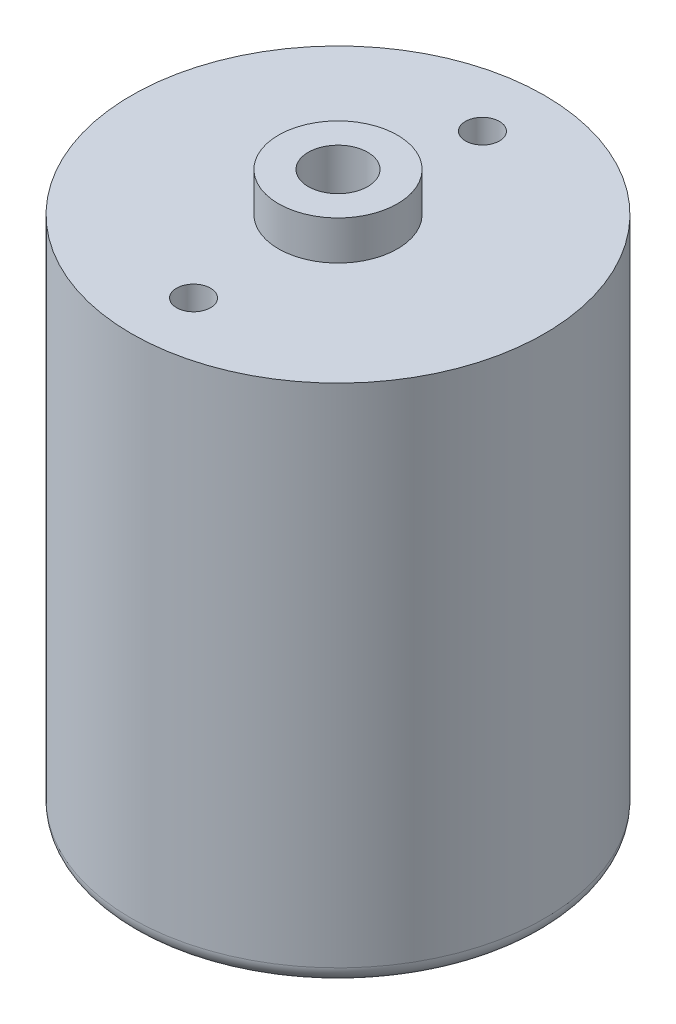
ISO-10303-21;
HEADER;
FILE_DESCRIPTION(('STEP AP214'),'2;1');
FILE_NAME('part.step','',(''),(''),'','','');
FILE_SCHEMA(('AUTOMOTIVE_DESIGN { 1 0 10303 214 1 1 1 1 }'));
ENDSEC;
DATA;
#1=APPLICATION_CONTEXT('core data for automotive mechanical design processes');
#2=APPLICATION_PROTOCOL_DEFINITION('international standard','automotive_design',2000,#1);
#3=PRODUCT_CONTEXT('',#1,'mechanical');
#4=PRODUCT('Part','Part','',(#3));
#5=PRODUCT_RELATED_PRODUCT_CATEGORY('part','',(#4));
#6=PRODUCT_DEFINITION_FORMATION('','',#4);
#7=PRODUCT_DEFINITION_CONTEXT('part definition',#1,'design');
#8=PRODUCT_DEFINITION('design','',#6,#7);
#9=PRODUCT_DEFINITION_SHAPE('','',#8);
#10=(LENGTH_UNIT() NAMED_UNIT(*) SI_UNIT(.MILLI.,.METRE.));
#11=(NAMED_UNIT(*) PLANE_ANGLE_UNIT() SI_UNIT($,.RADIAN.));
#12=(NAMED_UNIT(*) SI_UNIT($,.STERADIAN.) SOLID_ANGLE_UNIT());
#13=UNCERTAINTY_MEASURE_WITH_UNIT(LENGTH_MEASURE(1.E-05),#10,'distance_accuracy_value','');
#14=(GEOMETRIC_REPRESENTATION_CONTEXT(3) GLOBAL_UNCERTAINTY_ASSIGNED_CONTEXT((#13)) GLOBAL_UNIT_ASSIGNED_CONTEXT((#10,
#11,#12)) REPRESENTATION_CONTEXT('',''));
#15=CARTESIAN_POINT('',(0.,0.,0.));
#16=DIRECTION('',(0.,0.,1.));
#17=DIRECTION('',(1.,0.,0.));
#18=AXIS2_PLACEMENT_3D('',#15,#16,#17);
#19=CARTESIAN_POINT('',(0.,30.8,0.));
#20=DIRECTION('',(0.,-1.,0.));
#21=DIRECTION('',(0.,0.,-1.));
#22=AXIS2_PLACEMENT_3D('',#19,#20,#21);
#23=CYLINDRICAL_SURFACE('',#22,12.15);
#24=CARTESIAN_POINT('',(0.,1.,0.));
#25=DIRECTION('',(0.,1.,0.));
#26=DIRECTION('',(0.,0.,1.));
#27=AXIS2_PLACEMENT_3D('',#24,#25,#26);
#28=CIRCLE('',#27,12.15);
#29=CARTESIAN_POINT('',(0.,0.999999999999997,-12.15));
#30=VERTEX_POINT('',#29);
#31=EDGE_CURVE('E46',#30,#30,#28,.T.);
#32=CARTESIAN_POINT('',(0.,30.8,0.));
#33=DIRECTION('',(0.,1.,0.));
#34=DIRECTION('',(0.,0.,1.));
#35=AXIS2_PLACEMENT_3D('',#32,#33,#34);
#36=CIRCLE('',#35,12.15);
#37=CARTESIAN_POINT('',(0.,30.8,-12.15));
#38=VERTEX_POINT('',#37);
#39=EDGE_CURVE('E51',#38,#38,#36,.T.);
#40=CARTESIAN_POINT('',(0.,0.999999999999997,-12.15));
#41=CARTESIAN_POINT('',(0.,1.31041666666667,-12.15));
#42=CARTESIAN_POINT('',(0.,1.62083333333333,-12.15));
#43=CARTESIAN_POINT('',(0.,2.24166666666666,-12.15));
#44=CARTESIAN_POINT('',(0.,2.55208333333333,-12.15));
#45=CARTESIAN_POINT('',(0.,3.17291666666666,-12.15));
#46=CARTESIAN_POINT('',(0.,3.48333333333333,-12.15));
#47=CARTESIAN_POINT('',(0.,4.10416666666667,-12.15));
#48=CARTESIAN_POINT('',(0.,4.41458333333333,-12.15));
#49=CARTESIAN_POINT('',(0.,5.03541666666666,-12.15));
#50=CARTESIAN_POINT('',(0.,5.34583333333333,-12.15));
#51=CARTESIAN_POINT('',(0.,5.96666666666667,-12.15));
#52=CARTESIAN_POINT('',(0.,6.27708333333333,-12.15));
#53=CARTESIAN_POINT('',(0.,6.89791666666667,-12.15));
#54=CARTESIAN_POINT('',(0.,7.20833333333333,-12.15));
#55=CARTESIAN_POINT('',(0.,7.82916666666666,-12.15));
#56=CARTESIAN_POINT('',(0.,8.13958333333333,-12.15));
#57=CARTESIAN_POINT('',(0.,8.76041666666666,-12.15));
#58=CARTESIAN_POINT('',(0.,9.07083333333333,-12.15));
#59=CARTESIAN_POINT('',(0.,9.69166666666666,-12.15));
#60=CARTESIAN_POINT('',(0.,10.0020833333333,-12.15));
#61=CARTESIAN_POINT('',(0.,10.6229166666667,-12.15));
#62=CARTESIAN_POINT('',(0.,10.9333333333333,-12.15));
#63=CARTESIAN_POINT('',(0.,11.5541666666667,-12.15));
#64=CARTESIAN_POINT('',(0.,11.8645833333333,-12.15));
#65=CARTESIAN_POINT('',(0.,12.4854166666667,-12.15));
#66=CARTESIAN_POINT('',(0.,12.7958333333333,-12.15));
#67=CARTESIAN_POINT('',(0.,13.4166666666667,-12.15));
#68=CARTESIAN_POINT('',(0.,13.7270833333333,-12.15));
#69=CARTESIAN_POINT('',(0.,14.3479166666667,-12.15));
#70=CARTESIAN_POINT('',(0.,14.6583333333333,-12.15));
#71=CARTESIAN_POINT('',(0.,15.2791666666667,-12.15));
#72=CARTESIAN_POINT('',(0.,15.5895833333333,-12.15));
#73=CARTESIAN_POINT('',(0.,16.2104166666667,-12.15));
#74=CARTESIAN_POINT('',(0.,16.5208333333333,-12.15));
#75=CARTESIAN_POINT('',(0.,17.1416666666667,-12.15));
#76=CARTESIAN_POINT('',(0.,17.4520833333333,-12.15));
#77=CARTESIAN_POINT('',(0.,18.0729166666667,-12.15));
#78=CARTESIAN_POINT('',(0.,18.3833333333333,-12.15));
#79=CARTESIAN_POINT('',(0.,19.0041666666667,-12.15));
#80=CARTESIAN_POINT('',(0.,19.3145833333333,-12.15));
#81=CARTESIAN_POINT('',(0.,19.9354166666667,-12.15));
#82=CARTESIAN_POINT('',(0.,20.2458333333333,-12.15));
#83=CARTESIAN_POINT('',(0.,20.8666666666667,-12.15));
#84=CARTESIAN_POINT('',(0.,21.1770833333333,-12.15));
#85=CARTESIAN_POINT('',(0.,21.7979166666667,-12.15));
#86=CARTESIAN_POINT('',(0.,22.1083333333333,-12.15));
#87=CARTESIAN_POINT('',(0.,22.7291666666667,-12.15));
#88=CARTESIAN_POINT('',(0.,23.0395833333333,-12.15));
#89=CARTESIAN_POINT('',(0.,23.6604166666667,-12.15));
#90=CARTESIAN_POINT('',(0.,23.9708333333333,-12.15));
#91=CARTESIAN_POINT('',(0.,24.5916666666667,-12.15));
#92=CARTESIAN_POINT('',(0.,24.9020833333333,-12.15));
#93=CARTESIAN_POINT('',(0.,25.5229166666667,-12.15));
#94=CARTESIAN_POINT('',(0.,25.8333333333333,-12.15));
#95=CARTESIAN_POINT('',(0.,26.4541666666667,-12.15));
#96=CARTESIAN_POINT('',(0.,26.7645833333333,-12.15));
#97=CARTESIAN_POINT('',(0.,27.3854166666667,-12.15));
#98=CARTESIAN_POINT('',(0.,27.6958333333333,-12.15));
#99=CARTESIAN_POINT('',(0.,28.3166666666667,-12.15));
#100=CARTESIAN_POINT('',(0.,28.6270833333333,-12.15));
#101=CARTESIAN_POINT('',(0.,29.2479166666667,-12.15));
#102=CARTESIAN_POINT('',(0.,29.5583333333333,-12.15));
#103=CARTESIAN_POINT('',(0.,30.1791666666667,-12.15));
#104=CARTESIAN_POINT('',(0.,30.4895833333333,-12.15));
#105=CARTESIAN_POINT('',(0.,30.8,-12.15));
#106=B_SPLINE_CURVE_WITH_KNOTS('',3,(#40,#41,#42,#43,#44,#45,#46,#47,#48,#49,#50,#51,#52,#53,
#54,#55,#56,#57,#58,#59,#60,#61,#62,#63,#64,#65,#66,#67,#68,#69,#70,#71,#72,#73,#74,#75,#76,#77,
#78,#79,#80,#81,#82,#83,#84,#85,#86,#87,#88,#89,#90,#91,#92,#93,#94,#95,#96,#97,#98,#99,#100,
#101,#102,#103,#104,#105),.UNSPECIFIED.,.F.,.F.,(4,2,2,2,2,2,2,2,2,2,2,2,2,2,2,2,2,2,2,2,2,2,2,
2,2,2,2,2,2,2,2,2,4),(0.,0.931250000000001,1.8625,2.79375,3.725,4.65625,5.5875,6.51875,7.45,
8.38125,9.3125,10.24375,11.175,12.10625,13.0375,13.96875,14.9,15.83125,16.7625,17.69375,18.625,
19.55625,20.4875,21.41875,22.35,23.28125,24.2125,25.14375,26.075,27.00625,27.9375,28.86875,
29.8),.UNSPECIFIED.);
#107=EDGE_CURVE('BSEAM34',#30,#38,#106,.T.);
#108=ORIENTED_EDGE('',*,*,#31,.T.);
#109=ORIENTED_EDGE('',*,*,#39,.F.);
#110=ORIENTED_EDGE('',*,*,#107,.T.);
#111=ORIENTED_EDGE('',*,*,#107,.F.);
#112=EDGE_LOOP('',(#108,#110,#109,#111));
#113=FACE_BOUND('',#112,.T.);
#114=ADVANCED_FACE('F34',(#113),#23,.T.);
#115=CARTESIAN_POINT('',(0.,30.8,0.));
#116=DIRECTION('',(0.,1.,0.));
#117=DIRECTION('',(0.,0.,1.));
#118=AXIS2_PLACEMENT_3D('',#115,#116,#117);
#119=PLANE('',#118);
#120=CARTESIAN_POINT('',(0.,30.8,8.5));
#121=DIRECTION('',(0.,1.,0.));
#122=DIRECTION('',(0.,0.,1.));
#123=AXIS2_PLACEMENT_3D('',#120,#121,#122);
#124=CIRCLE('',#123,1.);
#125=CARTESIAN_POINT('',(0.,30.8,9.5));
#126=VERTEX_POINT('',#125);
#127=EDGE_CURVE('E103',#126,#126,#124,.T.);
#128=ORIENTED_EDGE('',*,*,#127,.F.);
#129=EDGE_LOOP('',(#128));
#130=FACE_BOUND('',#129,.T.);
#131=CARTESIAN_POINT('',(0.,30.8,-8.5));
#132=DIRECTION('',(0.,1.,0.));
#133=DIRECTION('',(0.,0.,1.));
#134=AXIS2_PLACEMENT_3D('',#131,#132,#133);
#135=CIRCLE('',#134,1.);
#136=CARTESIAN_POINT('',(0.,30.8,-7.5));
#137=VERTEX_POINT('',#136);
#138=EDGE_CURVE('E109',#137,#137,#135,.T.);
#139=ORIENTED_EDGE('',*,*,#138,.F.);
#140=EDGE_LOOP('',(#139));
#141=FACE_BOUND('',#140,.T.);
#142=CARTESIAN_POINT('',(0.,30.8,0.));
#143=DIRECTION('',(0.,1.,0.));
#144=DIRECTION('',(0.,0.,1.));
#145=AXIS2_PLACEMENT_3D('',#142,#143,#144);
#146=CIRCLE('',#145,3.5);
#147=CARTESIAN_POINT('',(0.,30.8,3.5));
#148=VERTEX_POINT('',#147);
#149=EDGE_CURVE('E10',#148,#148,#146,.T.);
#150=ORIENTED_EDGE('',*,*,#149,.F.);
#151=EDGE_LOOP('',(#150));
#152=FACE_BOUND('',#151,.T.);
#153=ORIENTED_EDGE('',*,*,#39,.T.);
#154=EDGE_LOOP('',(#153));
#155=FACE_BOUND('',#154,.T.);
#156=ADVANCED_FACE('F68',(#130,#141,#152,#155),#119,.T.);
#157=CARTESIAN_POINT('',(0.,0.,0.));
#158=DIRECTION('',(0.,1.,0.));
#159=DIRECTION('',(0.,0.,1.));
#160=AXIS2_PLACEMENT_3D('',#157,#158,#159);
#161=PLANE('',#160);
#162=CARTESIAN_POINT('',(0.,0.,0.));
#163=DIRECTION('',(0.,1.,0.));
#164=DIRECTION('',(0.,0.,1.));
#165=AXIS2_PLACEMENT_3D('',#162,#163,#164);
#166=CIRCLE('',#165,1.75);
#167=CARTESIAN_POINT('',(0.,0.,1.75));
#168=VERTEX_POINT('',#167);
#169=EDGE_CURVE('E98',#168,#168,#166,.T.);
#170=ORIENTED_EDGE('',*,*,#169,.T.);
#171=EDGE_LOOP('',(#170));
#172=FACE_BOUND('',#171,.T.);
#173=CARTESIAN_POINT('',(0.,0.,8.5));
#174=DIRECTION('',(0.,1.,0.));
#175=DIRECTION('',(0.,0.,1.));
#176=AXIS2_PLACEMENT_3D('',#173,#174,#175);
#177=CIRCLE('',#176,1.);
#178=CARTESIAN_POINT('',(0.,0.,9.5));
#179=VERTEX_POINT('',#178);
#180=EDGE_CURVE('E106',#179,#179,#177,.T.);
#181=ORIENTED_EDGE('',*,*,#180,.T.);
#182=EDGE_LOOP('',(#181));
#183=FACE_BOUND('',#182,.T.);
#184=CARTESIAN_POINT('',(0.,0.,-8.5));
#185=DIRECTION('',(0.,1.,0.));
#186=DIRECTION('',(0.,0.,1.));
#187=AXIS2_PLACEMENT_3D('',#184,#185,#186);
#188=CIRCLE('',#187,1.);
#189=CARTESIAN_POINT('',(0.,0.,-7.5));
#190=VERTEX_POINT('',#189);
#191=EDGE_CURVE('E112',#190,#190,#188,.T.);
#192=ORIENTED_EDGE('',*,*,#191,.T.);
#193=EDGE_LOOP('',(#192));
#194=FACE_BOUND('',#193,.T.);
#195=CARTESIAN_POINT('',(0.,0.,0.));
#196=DIRECTION('',(0.,1.,0.));
#197=DIRECTION('',(0.,0.,1.));
#198=AXIS2_PLACEMENT_3D('',#195,#196,#197);
#199=CIRCLE('',#198,11.15);
#200=CARTESIAN_POINT('',(0.,0.,11.15));
#201=VERTEX_POINT('',#200);
#202=EDGE_CURVE('E38',#201,#201,#199,.F.);
#203=ORIENTED_EDGE('',*,*,#202,.T.);
#204=EDGE_LOOP('',(#203));
#205=FACE_BOUND('',#204,.T.);
#206=ADVANCED_FACE('F60',(#172,#183,#194,#205),#161,.F.);
#207=CARTESIAN_POINT('',(0.,1.,0.));
#208=DIRECTION('',(0.,1.,0.));
#209=DIRECTION('',(0.,0.,1.));
#210=AXIS2_PLACEMENT_3D('',#207,#208,#209);
#211=TOROIDAL_SURFACE('',#210,11.15,1.);
#212=ORIENTED_EDGE('',*,*,#202,.F.);
#213=EDGE_LOOP('',(#212));
#214=FACE_BOUND('',#213,.T.);
#215=ORIENTED_EDGE('',*,*,#31,.F.);
#216=EDGE_LOOP('',(#215));
#217=FACE_BOUND('',#216,.T.);
#218=ADVANCED_FACE('F36',(#214,#217),#211,.T.);
#219=CARTESIAN_POINT('',(0.,0.,0.));
#220=DIRECTION('',(0.,1.,0.));
#221=DIRECTION('',(0.,0.,1.));
#222=AXIS2_PLACEMENT_3D('',#219,#220,#221);
#223=CYLINDRICAL_SURFACE('',#222,3.5);
#224=CARTESIAN_POINT('',(0.,33.1,0.));
#225=DIRECTION('',(0.,1.,0.));
#226=DIRECTION('',(0.,0.,1.));
#227=AXIS2_PLACEMENT_3D('',#224,#225,#226);
#228=CIRCLE('',#227,3.5);
#229=CARTESIAN_POINT('',(0.,33.1,3.5));
#230=VERTEX_POINT('',#229);
#231=EDGE_CURVE('E49',#230,#230,#228,.T.);
#232=CARTESIAN_POINT('',(0.,30.8,3.5));
#233=CARTESIAN_POINT('',(0.,30.8239583333333,3.5));
#234=CARTESIAN_POINT('',(0.,30.8479166666667,3.5));
#235=CARTESIAN_POINT('',(0.,30.8958333333333,3.5));
#236=CARTESIAN_POINT('',(0.,30.9197916666667,3.5));
#237=CARTESIAN_POINT('',(0.,30.9677083333333,3.5));
#238=CARTESIAN_POINT('',(0.,30.9916666666667,3.5));
#239=CARTESIAN_POINT('',(0.,31.0395833333333,3.5));
#240=CARTESIAN_POINT('',(0.,31.0635416666667,3.5));
#241=CARTESIAN_POINT('',(0.,31.1114583333333,3.5));
#242=CARTESIAN_POINT('',(0.,31.1354166666667,3.5));
#243=CARTESIAN_POINT('',(0.,31.1833333333333,3.5));
#244=CARTESIAN_POINT('',(0.,31.2072916666667,3.5));
#245=CARTESIAN_POINT('',(0.,31.2552083333333,3.5));
#246=CARTESIAN_POINT('',(0.,31.2791666666667,3.5));
#247=CARTESIAN_POINT('',(0.,31.3270833333333,3.5));
#248=CARTESIAN_POINT('',(0.,31.3510416666667,3.5));
#249=CARTESIAN_POINT('',(0.,31.3989583333333,3.5));
#250=CARTESIAN_POINT('',(0.,31.4229166666667,3.5));
#251=CARTESIAN_POINT('',(0.,31.4708333333333,3.5));
#252=CARTESIAN_POINT('',(0.,31.4947916666667,3.5));
#253=CARTESIAN_POINT('',(0.,31.5427083333333,3.5));
#254=CARTESIAN_POINT('',(0.,31.5666666666667,3.5));
#255=CARTESIAN_POINT('',(0.,31.6145833333333,3.5));
#256=CARTESIAN_POINT('',(0.,31.6385416666667,3.5));
#257=CARTESIAN_POINT('',(0.,31.6864583333333,3.5));
#258=CARTESIAN_POINT('',(0.,31.7104166666667,3.5));
#259=CARTESIAN_POINT('',(0.,31.7583333333333,3.5));
#260=CARTESIAN_POINT('',(0.,31.7822916666667,3.5));
#261=CARTESIAN_POINT('',(0.,31.8302083333333,3.5));
#262=CARTESIAN_POINT('',(0.,31.8541666666667,3.5));
#263=CARTESIAN_POINT('',(0.,31.9020833333333,3.5));
#264=CARTESIAN_POINT('',(0.,31.9260416666667,3.5));
#265=CARTESIAN_POINT('',(0.,31.9739583333333,3.5));
#266=CARTESIAN_POINT('',(0.,31.9979166666667,3.5));
#267=CARTESIAN_POINT('',(0.,32.0458333333333,3.5));
#268=CARTESIAN_POINT('',(0.,32.0697916666667,3.5));
#269=CARTESIAN_POINT('',(0.,32.1177083333333,3.5));
#270=CARTESIAN_POINT('',(0.,32.1416666666667,3.5));
#271=CARTESIAN_POINT('',(0.,32.1895833333333,3.5));
#272=CARTESIAN_POINT('',(0.,32.2135416666667,3.5));
#273=CARTESIAN_POINT('',(0.,32.2614583333333,3.5));
#274=CARTESIAN_POINT('',(0.,32.2854166666667,3.5));
#275=CARTESIAN_POINT('',(0.,32.3333333333333,3.5));
#276=CARTESIAN_POINT('',(0.,32.3572916666667,3.5));
#277=CARTESIAN_POINT('',(0.,32.4052083333333,3.5));
#278=CARTESIAN_POINT('',(0.,32.4291666666667,3.5));
#279=CARTESIAN_POINT('',(0.,32.4770833333333,3.5));
#280=CARTESIAN_POINT('',(0.,32.5010416666667,3.5));
#281=CARTESIAN_POINT('',(0.,32.5489583333333,3.5));
#282=CARTESIAN_POINT('',(0.,32.5729166666667,3.5));
#283=CARTESIAN_POINT('',(0.,32.6208333333333,3.5));
#284=CARTESIAN_POINT('',(0.,32.6447916666667,3.5));
#285=CARTESIAN_POINT('',(0.,32.6927083333333,3.5));
#286=CARTESIAN_POINT('',(0.,32.7166666666667,3.5));
#287=CARTESIAN_POINT('',(0.,32.7645833333333,3.5));
#288=CARTESIAN_POINT('',(0.,32.7885416666667,3.5));
#289=CARTESIAN_POINT('',(0.,32.8364583333333,3.5));
#290=CARTESIAN_POINT('',(0.,32.8604166666667,3.5));
#291=CARTESIAN_POINT('',(0.,32.9083333333333,3.5));
#292=CARTESIAN_POINT('',(0.,32.9322916666667,3.5));
#293=CARTESIAN_POINT('',(0.,32.9802083333333,3.5));
#294=CARTESIAN_POINT('',(0.,33.0041666666667,3.5));
#295=CARTESIAN_POINT('',(0.,33.0520833333333,3.5));
#296=CARTESIAN_POINT('',(0.,33.0760416666667,3.5));
#297=CARTESIAN_POINT('',(0.,33.1,3.5));
#298=B_SPLINE_CURVE_WITH_KNOTS('',3,(#232,#233,#234,#235,#236,#237,#238,#239,#240,#241,#242,
#243,#244,#245,#246,#247,#248,#249,#250,#251,#252,#253,#254,#255,#256,#257,#258,#259,#260,#261,
#262,#263,#264,#265,#266,#267,#268,#269,#270,#271,#272,#273,#274,#275,#276,#277,#278,#279,#280,
#281,#282,#283,#284,#285,#286,#287,#288,#289,#290,#291,#292,#293,#294,#295,#296,#297),
.UNSPECIFIED.,.F.,.F.,(4,2,2,2,2,2,2,2,2,2,2,2,2,2,2,2,2,2,2,2,2,2,2,2,2,2,2,2,2,2,2,2,4),(0.,
0.071874999999999,0.143750000000002,0.215625000000001,0.2875,0.359375000000002,
0.431250000000001,0.503124999999997,0.574999999999996,0.646874999999995,0.718750000000001,
0.790625,0.862499999999999,0.934374999999998,1.00625,1.078125,1.15,1.221875,1.29375,1.365625,
1.4375,1.509375,1.58125,1.653125,1.725,1.796875,1.86875,1.940625,2.0125,2.084375,2.15625,
2.228125,2.3),.UNSPECIFIED.);
#299=EDGE_CURVE('BSEAM59',#148,#230,#298,.T.);
#300=ORIENTED_EDGE('',*,*,#149,.T.);
#301=ORIENTED_EDGE('',*,*,#231,.F.);
#302=ORIENTED_EDGE('',*,*,#299,.T.);
#303=ORIENTED_EDGE('',*,*,#299,.F.);
#304=EDGE_LOOP('',(#300,#302,#301,#303));
#305=FACE_BOUND('',#304,.T.);
#306=ADVANCED_FACE('F59',(#305),#223,.T.);
#307=CARTESIAN_POINT('',(0.,33.1,0.));
#308=DIRECTION('',(0.,1.,0.));
#309=DIRECTION('',(0.,0.,1.));
#310=AXIS2_PLACEMENT_3D('',#307,#308,#309);
#311=PLANE('',#310);
#312=CARTESIAN_POINT('',(0.,33.1,0.));
#313=DIRECTION('',(0.,1.,0.));
#314=DIRECTION('',(0.,0.,1.));
#315=AXIS2_PLACEMENT_3D('',#312,#313,#314);
#316=CIRCLE('',#315,1.75);
#317=CARTESIAN_POINT('',(0.,33.1,1.75));
#318=VERTEX_POINT('',#317);
#319=EDGE_CURVE('E101',#318,#318,#316,.T.);
#320=ORIENTED_EDGE('',*,*,#319,.F.);
#321=EDGE_LOOP('',(#320));
#322=FACE_BOUND('',#321,.T.);
#323=ORIENTED_EDGE('',*,*,#231,.T.);
#324=EDGE_LOOP('',(#323));
#325=FACE_BOUND('',#324,.T.);
#326=ADVANCED_FACE('F66',(#322,#325),#311,.T.);
#327=CARTESIAN_POINT('',(0.,0.,-8.5));
#328=DIRECTION('',(0.,1.,0.));
#329=DIRECTION('',(0.,0.,1.));
#330=AXIS2_PLACEMENT_3D('',#327,#328,#329);
#331=CYLINDRICAL_SURFACE('',#330,1.);
#332=CARTESIAN_POINT('',(0.,0.,-7.5));
#333=CARTESIAN_POINT('',(0.,0.320833333333333,-7.5));
#334=CARTESIAN_POINT('',(0.,0.641666666666667,-7.5));
#335=CARTESIAN_POINT('',(0.,1.28333333333333,-7.5));
#336=CARTESIAN_POINT('',(0.,1.60416666666667,-7.5));
#337=CARTESIAN_POINT('',(0.,2.24583333333333,-7.5));
#338=CARTESIAN_POINT('',(0.,2.56666666666667,-7.5));
#339=CARTESIAN_POINT('',(0.,3.20833333333333,-7.5));
#340=CARTESIAN_POINT('',(0.,3.52916666666667,-7.5));
#341=CARTESIAN_POINT('',(0.,4.17083333333333,-7.5));
#342=CARTESIAN_POINT('',(0.,4.49166666666667,-7.5));
#343=CARTESIAN_POINT('',(0.,5.13333333333333,-7.5));
#344=CARTESIAN_POINT('',(0.,5.45416666666667,-7.5));
#345=CARTESIAN_POINT('',(0.,6.09583333333333,-7.5));
#346=CARTESIAN_POINT('',(0.,6.41666666666667,-7.5));
#347=CARTESIAN_POINT('',(0.,7.05833333333333,-7.5));
#348=CARTESIAN_POINT('',(0.,7.37916666666667,-7.5));
#349=CARTESIAN_POINT('',(0.,8.02083333333333,-7.5));
#350=CARTESIAN_POINT('',(0.,8.34166666666667,-7.5));
#351=CARTESIAN_POINT('',(0.,8.98333333333333,-7.5));
#352=CARTESIAN_POINT('',(0.,9.30416666666667,-7.5));
#353=CARTESIAN_POINT('',(0.,9.94583333333333,-7.5));
#354=CARTESIAN_POINT('',(0.,10.2666666666667,-7.5));
#355=CARTESIAN_POINT('',(0.,10.9083333333333,-7.5));
#356=CARTESIAN_POINT('',(0.,11.2291666666667,-7.5));
#357=CARTESIAN_POINT('',(0.,11.8708333333333,-7.5));
#358=CARTESIAN_POINT('',(0.,12.1916666666667,-7.5));
#359=CARTESIAN_POINT('',(0.,12.8333333333333,-7.5));
#360=CARTESIAN_POINT('',(0.,13.1541666666667,-7.5));
#361=CARTESIAN_POINT('',(0.,13.7958333333333,-7.5));
#362=CARTESIAN_POINT('',(0.,14.1166666666667,-7.5));
#363=CARTESIAN_POINT('',(0.,14.7583333333333,-7.5));
#364=CARTESIAN_POINT('',(0.,15.0791666666667,-7.5));
#365=CARTESIAN_POINT('',(0.,15.7208333333333,-7.5));
#366=CARTESIAN_POINT('',(0.,16.0416666666667,-7.5));
#367=CARTESIAN_POINT('',(0.,16.6833333333333,-7.5));
#368=CARTESIAN_POINT('',(0.,17.0041666666667,-7.5));
#369=CARTESIAN_POINT('',(0.,17.6458333333333,-7.5));
#370=CARTESIAN_POINT('',(0.,17.9666666666667,-7.5));
#371=CARTESIAN_POINT('',(0.,18.6083333333333,-7.5));
#372=CARTESIAN_POINT('',(0.,18.9291666666667,-7.5));
#373=CARTESIAN_POINT('',(0.,19.5708333333333,-7.5));
#374=CARTESIAN_POINT('',(0.,19.8916666666667,-7.5));
#375=CARTESIAN_POINT('',(0.,20.5333333333333,-7.5));
#376=CARTESIAN_POINT('',(0.,20.8541666666667,-7.5));
#377=CARTESIAN_POINT('',(0.,21.4958333333333,-7.5));
#378=CARTESIAN_POINT('',(0.,21.8166666666667,-7.5));
#379=CARTESIAN_POINT('',(0.,22.4583333333333,-7.5));
#380=CARTESIAN_POINT('',(0.,22.7791666666667,-7.5));
#381=CARTESIAN_POINT('',(0.,23.4208333333333,-7.5));
#382=CARTESIAN_POINT('',(0.,23.7416666666667,-7.5));
#383=CARTESIAN_POINT('',(0.,24.3833333333333,-7.5));
#384=CARTESIAN_POINT('',(0.,24.7041666666667,-7.5));
#385=CARTESIAN_POINT('',(0.,25.3458333333333,-7.5));
#386=CARTESIAN_POINT('',(0.,25.6666666666667,-7.5));
#387=CARTESIAN_POINT('',(0.,26.3083333333333,-7.5));
#388=CARTESIAN_POINT('',(0.,26.6291666666667,-7.5));
#389=CARTESIAN_POINT('',(0.,27.2708333333333,-7.5));
#390=CARTESIAN_POINT('',(0.,27.5916666666667,-7.5));
#391=CARTESIAN_POINT('',(0.,28.2333333333333,-7.5));
#392=CARTESIAN_POINT('',(0.,28.5541666666667,-7.5));
#393=CARTESIAN_POINT('',(0.,29.1958333333333,-7.5));
#394=CARTESIAN_POINT('',(0.,29.5166666666667,-7.5));
#395=CARTESIAN_POINT('',(0.,30.1583333333333,-7.5));
#396=CARTESIAN_POINT('',(0.,30.4791666666667,-7.5));
#397=CARTESIAN_POINT('',(0.,30.8,-7.5));
#398=B_SPLINE_CURVE_WITH_KNOTS('',3,(#332,#333,#334,#335,#336,#337,#338,#339,#340,#341,#342,
#343,#344,#345,#346,#347,#348,#349,#350,#351,#352,#353,#354,#355,#356,#357,#358,#359,#360,#361,
#362,#363,#364,#365,#366,#367,#368,#369,#370,#371,#372,#373,#374,#375,#376,#377,#378,#379,#380,
#381,#382,#383,#384,#385,#386,#387,#388,#389,#390,#391,#392,#393,#394,#395,#396,#397),
.UNSPECIFIED.,.F.,.F.,(4,2,2,2,2,2,2,2,2,2,2,2,2,2,2,2,2,2,2,2,2,2,2,2,2,2,2,2,2,2,2,2,4),(0.,
0.9625,1.925,2.8875,3.85,4.8125,5.775,6.7375,7.7,8.6625,9.625,10.5875,11.55,12.5125,13.475,
14.4375,15.4,16.3625,17.325,18.2875,19.25,20.2125,21.175,22.1375,23.1,24.0625,25.025,25.9875,
26.95,27.9125,28.875,29.8375,30.8),.UNSPECIFIED.);
#399=EDGE_CURVE('BSEAM81',#190,#137,#398,.T.);
#400=ORIENTED_EDGE('',*,*,#191,.F.);
#401=ORIENTED_EDGE('',*,*,#138,.T.);
#402=ORIENTED_EDGE('',*,*,#399,.T.);
#403=ORIENTED_EDGE('',*,*,#399,.F.);
#404=EDGE_LOOP('',(#400,#402,#401,#403));
#405=FACE_BOUND('',#404,.T.);
#406=ADVANCED_FACE('F81',(#405),#331,.F.);
#407=CARTESIAN_POINT('',(0.,0.,8.5));
#408=DIRECTION('',(0.,1.,0.));
#409=DIRECTION('',(0.,0.,1.));
#410=AXIS2_PLACEMENT_3D('',#407,#408,#409);
#411=CYLINDRICAL_SURFACE('',#410,1.);
#412=CARTESIAN_POINT('',(0.,0.,9.5));
#413=CARTESIAN_POINT('',(0.,0.320833333333333,9.5));
#414=CARTESIAN_POINT('',(0.,0.641666666666667,9.5));
#415=CARTESIAN_POINT('',(0.,1.28333333333333,9.5));
#416=CARTESIAN_POINT('',(0.,1.60416666666667,9.5));
#417=CARTESIAN_POINT('',(0.,2.24583333333333,9.5));
#418=CARTESIAN_POINT('',(0.,2.56666666666667,9.5));
#419=CARTESIAN_POINT('',(0.,3.20833333333333,9.5));
#420=CARTESIAN_POINT('',(0.,3.52916666666667,9.5));
#421=CARTESIAN_POINT('',(0.,4.17083333333333,9.5));
#422=CARTESIAN_POINT('',(0.,4.49166666666667,9.5));
#423=CARTESIAN_POINT('',(0.,5.13333333333333,9.5));
#424=CARTESIAN_POINT('',(0.,5.45416666666667,9.5));
#425=CARTESIAN_POINT('',(0.,6.09583333333333,9.5));
#426=CARTESIAN_POINT('',(0.,6.41666666666667,9.5));
#427=CARTESIAN_POINT('',(0.,7.05833333333333,9.5));
#428=CARTESIAN_POINT('',(0.,7.37916666666667,9.5));
#429=CARTESIAN_POINT('',(0.,8.02083333333333,9.5));
#430=CARTESIAN_POINT('',(0.,8.34166666666667,9.5));
#431=CARTESIAN_POINT('',(0.,8.98333333333333,9.5));
#432=CARTESIAN_POINT('',(0.,9.30416666666667,9.5));
#433=CARTESIAN_POINT('',(0.,9.94583333333333,9.5));
#434=CARTESIAN_POINT('',(0.,10.2666666666667,9.5));
#435=CARTESIAN_POINT('',(0.,10.9083333333333,9.5));
#436=CARTESIAN_POINT('',(0.,11.2291666666667,9.5));
#437=CARTESIAN_POINT('',(0.,11.8708333333333,9.5));
#438=CARTESIAN_POINT('',(0.,12.1916666666667,9.5));
#439=CARTESIAN_POINT('',(0.,12.8333333333333,9.5));
#440=CARTESIAN_POINT('',(0.,13.1541666666667,9.5));
#441=CARTESIAN_POINT('',(0.,13.7958333333333,9.5));
#442=CARTESIAN_POINT('',(0.,14.1166666666667,9.5));
#443=CARTESIAN_POINT('',(0.,14.7583333333333,9.5));
#444=CARTESIAN_POINT('',(0.,15.0791666666667,9.5));
#445=CARTESIAN_POINT('',(0.,15.7208333333333,9.5));
#446=CARTESIAN_POINT('',(0.,16.0416666666667,9.5));
#447=CARTESIAN_POINT('',(0.,16.6833333333333,9.5));
#448=CARTESIAN_POINT('',(0.,17.0041666666667,9.5));
#449=CARTESIAN_POINT('',(0.,17.6458333333333,9.5));
#450=CARTESIAN_POINT('',(0.,17.9666666666667,9.5));
#451=CARTESIAN_POINT('',(0.,18.6083333333333,9.5));
#452=CARTESIAN_POINT('',(0.,18.9291666666667,9.5));
#453=CARTESIAN_POINT('',(0.,19.5708333333333,9.5));
#454=CARTESIAN_POINT('',(0.,19.8916666666667,9.5));
#455=CARTESIAN_POINT('',(0.,20.5333333333333,9.5));
#456=CARTESIAN_POINT('',(0.,20.8541666666667,9.5));
#457=CARTESIAN_POINT('',(0.,21.4958333333333,9.5));
#458=CARTESIAN_POINT('',(0.,21.8166666666667,9.5));
#459=CARTESIAN_POINT('',(0.,22.4583333333333,9.5));
#460=CARTESIAN_POINT('',(0.,22.7791666666667,9.5));
#461=CARTESIAN_POINT('',(0.,23.4208333333333,9.5));
#462=CARTESIAN_POINT('',(0.,23.7416666666667,9.5));
#463=CARTESIAN_POINT('',(0.,24.3833333333333,9.5));
#464=CARTESIAN_POINT('',(0.,24.7041666666667,9.5));
#465=CARTESIAN_POINT('',(0.,25.3458333333333,9.5));
#466=CARTESIAN_POINT('',(0.,25.6666666666667,9.5));
#467=CARTESIAN_POINT('',(0.,26.3083333333333,9.5));
#468=CARTESIAN_POINT('',(0.,26.6291666666667,9.5));
#469=CARTESIAN_POINT('',(0.,27.2708333333333,9.5));
#470=CARTESIAN_POINT('',(0.,27.5916666666667,9.5));
#471=CARTESIAN_POINT('',(0.,28.2333333333333,9.5));
#472=CARTESIAN_POINT('',(0.,28.5541666666667,9.5));
#473=CARTESIAN_POINT('',(0.,29.1958333333333,9.5));
#474=CARTESIAN_POINT('',(0.,29.5166666666667,9.5));
#475=CARTESIAN_POINT('',(0.,30.1583333333333,9.5));
#476=CARTESIAN_POINT('',(0.,30.4791666666667,9.5));
#477=CARTESIAN_POINT('',(0.,30.8,9.5));
#478=B_SPLINE_CURVE_WITH_KNOTS('',3,(#412,#413,#414,#415,#416,#417,#418,#419,#420,#421,#422,
#423,#424,#425,#426,#427,#428,#429,#430,#431,#432,#433,#434,#435,#436,#437,#438,#439,#440,#441,
#442,#443,#444,#445,#446,#447,#448,#449,#450,#451,#452,#453,#454,#455,#456,#457,#458,#459,#460,
#461,#462,#463,#464,#465,#466,#467,#468,#469,#470,#471,#472,#473,#474,#475,#476,#477),
.UNSPECIFIED.,.F.,.F.,(4,2,2,2,2,2,2,2,2,2,2,2,2,2,2,2,2,2,2,2,2,2,2,2,2,2,2,2,2,2,2,2,4),(0.,
0.9625,1.925,2.8875,3.85,4.8125,5.775,6.7375,7.7,8.6625,9.625,10.5875,11.55,12.5125,13.475,
14.4375,15.4,16.3625,17.325,18.2875,19.25,20.2125,21.175,22.1375,23.1,24.0625,25.025,25.9875,
26.95,27.9125,28.875,29.8375,30.8),.UNSPECIFIED.);
#479=EDGE_CURVE('BSEAM85',#179,#126,#478,.T.);
#480=ORIENTED_EDGE('',*,*,#180,.F.);
#481=ORIENTED_EDGE('',*,*,#127,.T.);
#482=ORIENTED_EDGE('',*,*,#479,.T.);
#483=ORIENTED_EDGE('',*,*,#479,.F.);
#484=EDGE_LOOP('',(#480,#482,#481,#483));
#485=FACE_BOUND('',#484,.T.);
#486=ADVANCED_FACE('F85',(#485),#411,.F.);
#487=CARTESIAN_POINT('',(0.,0.,0.));
#488=DIRECTION('',(0.,1.,0.));
#489=DIRECTION('',(0.,0.,1.));
#490=AXIS2_PLACEMENT_3D('',#487,#488,#489);
#491=CYLINDRICAL_SURFACE('',#490,1.75);
#492=ORIENTED_EDGE('',*,*,#169,.F.);
#493=EDGE_LOOP('',(#492));
#494=FACE_BOUND('',#493,.T.);
#495=ORIENTED_EDGE('',*,*,#319,.T.);
#496=EDGE_LOOP('',(#495));
#497=FACE_BOUND('',#496,.T.);
#498=ADVANCED_FACE('F89',(#494,#497),#491,.F.);
#499=CLOSED_SHELL('',(#114,#156,#206,#218,#306,#326,#406,#486,#498));
#500=MANIFOLD_SOLID_BREP('B2',#499);
#501=ADVANCED_BREP_SHAPE_REPRESENTATION('',(#18,#500),#14);
#502=SHAPE_DEFINITION_REPRESENTATION(#9,#501);
ENDSEC;
END-ISO-10303-21;
